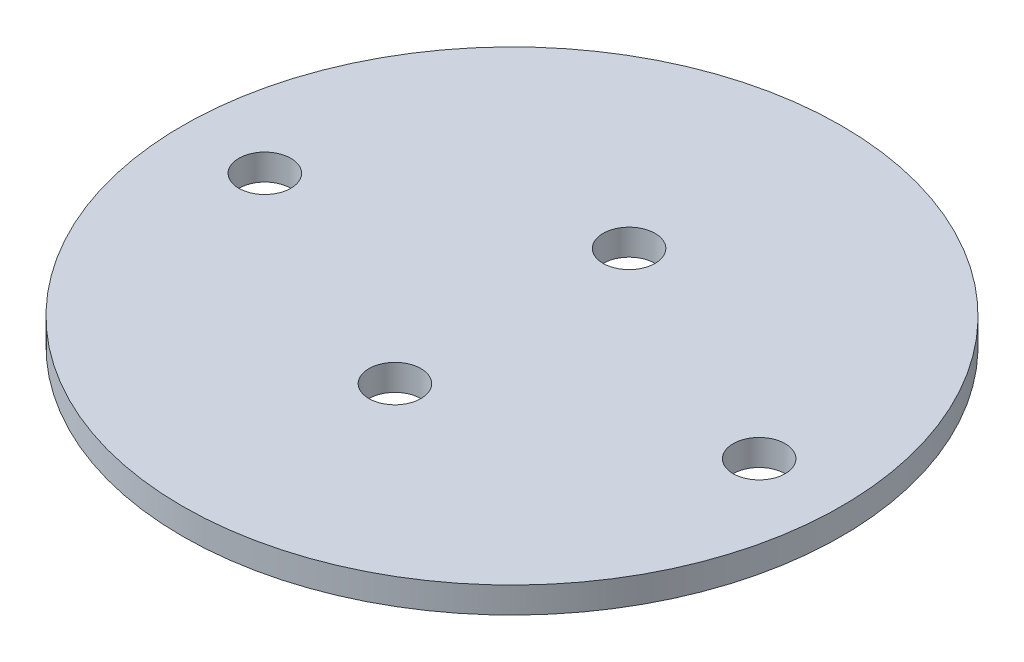
ISO-10303-21;
HEADER;
FILE_DESCRIPTION(('STEP AP214'),'2;1');
FILE_NAME('part.step','',(''),(''),'','','');
FILE_SCHEMA(('AUTOMOTIVE_DESIGN { 1 0 10303 214 1 1 1 1 }'));
ENDSEC;
DATA;
#1=APPLICATION_CONTEXT('core data for automotive mechanical design processes');
#2=APPLICATION_PROTOCOL_DEFINITION('international standard','automotive_design',2000,#1);
#3=PRODUCT_CONTEXT('',#1,'mechanical');
#4=PRODUCT('Part','Part','',(#3));
#5=PRODUCT_RELATED_PRODUCT_CATEGORY('part','',(#4));
#6=PRODUCT_DEFINITION_FORMATION('','',#4);
#7=PRODUCT_DEFINITION_CONTEXT('part definition',#1,'design');
#8=PRODUCT_DEFINITION('design','',#6,#7);
#9=PRODUCT_DEFINITION_SHAPE('','',#8);
#10=(LENGTH_UNIT() NAMED_UNIT(*) SI_UNIT(.MILLI.,.METRE.));
#11=(NAMED_UNIT(*) PLANE_ANGLE_UNIT() SI_UNIT($,.RADIAN.));
#12=(NAMED_UNIT(*) SI_UNIT($,.STERADIAN.) SOLID_ANGLE_UNIT());
#13=UNCERTAINTY_MEASURE_WITH_UNIT(LENGTH_MEASURE(1.E-05),#10,'distance_accuracy_value','');
#14=(GEOMETRIC_REPRESENTATION_CONTEXT(3) GLOBAL_UNCERTAINTY_ASSIGNED_CONTEXT((#13)) GLOBAL_UNIT_ASSIGNED_CONTEXT((#10,
#11,#12)) REPRESENTATION_CONTEXT('',''));
#15=CARTESIAN_POINT('',(0.,0.,0.));
#16=DIRECTION('',(0.,0.,1.));
#17=DIRECTION('',(1.,0.,0.));
#18=AXIS2_PLACEMENT_3D('',#15,#16,#17);
#19=CARTESIAN_POINT('',(28.5,-3.,0.));
#20=DIRECTION('',(0.,1.,0.));
#21=DIRECTION('',(0.,0.,1.));
#22=AXIS2_PLACEMENT_3D('',#19,#20,#21);
#23=CYLINDRICAL_SURFACE('',#22,3.);
#24=CARTESIAN_POINT('',(28.5,-3.,0.));
#25=DIRECTION('',(0.,1.,0.));
#26=DIRECTION('',(0.,0.,1.));
#27=AXIS2_PLACEMENT_3D('',#24,#25,#26);
#28=CIRCLE('',#27,3.);
#29=CARTESIAN_POINT('',(28.5,-3.,2.99999999999999));
#30=VERTEX_POINT('',#29);
#31=EDGE_CURVE('E45',#30,#30,#28,.T.);
#32=ORIENTED_EDGE('',*,*,#31,.F.);
#33=EDGE_LOOP('',(#32));
#34=FACE_BOUND('',#33,.T.);
#35=CARTESIAN_POINT('',(28.5,0.,0.));
#36=DIRECTION('',(0.,1.,0.));
#37=DIRECTION('',(0.,0.,1.));
#38=AXIS2_PLACEMENT_3D('',#35,#36,#37);
#39=CIRCLE('',#38,3.);
#40=CARTESIAN_POINT('',(28.5,0.,2.99999999999999));
#41=VERTEX_POINT('',#40);
#42=EDGE_CURVE('E62',#41,#41,#39,.T.);
#43=ORIENTED_EDGE('',*,*,#42,.T.);
#44=EDGE_LOOP('',(#43));
#45=FACE_BOUND('',#44,.T.);
#46=ADVANCED_FACE('F37',(#34,#45),#23,.F.);
#47=CARTESIAN_POINT('',(-28.5,-3.,0.));
#48=DIRECTION('',(0.,1.,0.));
#49=DIRECTION('',(0.,0.,1.));
#50=AXIS2_PLACEMENT_3D('',#47,#48,#49);
#51=CYLINDRICAL_SURFACE('',#50,3.);
#52=CARTESIAN_POINT('',(-28.5,-3.,0.));
#53=DIRECTION('',(0.,1.,0.));
#54=DIRECTION('',(0.,0.,1.));
#55=AXIS2_PLACEMENT_3D('',#52,#53,#54);
#56=CIRCLE('',#55,3.);
#57=CARTESIAN_POINT('',(-28.5,-3.,3.));
#58=VERTEX_POINT('',#57);
#59=EDGE_CURVE('E50',#58,#58,#56,.T.);
#60=ORIENTED_EDGE('',*,*,#59,.F.);
#61=EDGE_LOOP('',(#60));
#62=FACE_BOUND('',#61,.T.);
#63=CARTESIAN_POINT('',(-28.5,0.,0.));
#64=DIRECTION('',(0.,1.,0.));
#65=DIRECTION('',(0.,0.,1.));
#66=AXIS2_PLACEMENT_3D('',#63,#64,#65);
#67=CIRCLE('',#66,3.);
#68=CARTESIAN_POINT('',(-28.5,0.,3.));
#69=VERTEX_POINT('',#68);
#70=EDGE_CURVE('E60',#69,#69,#67,.T.);
#71=ORIENTED_EDGE('',*,*,#70,.T.);
#72=EDGE_LOOP('',(#71));
#73=FACE_BOUND('',#72,.T.);
#74=ADVANCED_FACE('F83',(#62,#73),#51,.F.);
#75=CARTESIAN_POINT('',(0.,-3.,-13.5));
#76=DIRECTION('',(0.,1.,0.));
#77=DIRECTION('',(0.,0.,1.));
#78=AXIS2_PLACEMENT_3D('',#75,#76,#77);
#79=CYLINDRICAL_SURFACE('',#78,3.);
#80=CARTESIAN_POINT('',(0.,-3.,-13.5));
#81=DIRECTION('',(0.,1.,0.));
#82=DIRECTION('',(0.,0.,1.));
#83=AXIS2_PLACEMENT_3D('',#80,#81,#82);
#84=CIRCLE('',#83,3.);
#85=CARTESIAN_POINT('',(0.,-3.,-10.5));
#86=VERTEX_POINT('',#85);
#87=EDGE_CURVE('E71',#86,#86,#84,.T.);
#88=ORIENTED_EDGE('',*,*,#87,.F.);
#89=EDGE_LOOP('',(#88));
#90=FACE_BOUND('',#89,.T.);
#91=CARTESIAN_POINT('',(0.,0.,-13.5));
#92=DIRECTION('',(0.,1.,0.));
#93=DIRECTION('',(0.,0.,1.));
#94=AXIS2_PLACEMENT_3D('',#91,#92,#93);
#95=CIRCLE('',#94,3.);
#96=CARTESIAN_POINT('',(0.,0.,-10.5));
#97=VERTEX_POINT('',#96);
#98=EDGE_CURVE('E57',#97,#97,#95,.T.);
#99=ORIENTED_EDGE('',*,*,#98,.T.);
#100=EDGE_LOOP('',(#99));
#101=FACE_BOUND('',#100,.T.);
#102=ADVANCED_FACE('F86',(#90,#101),#79,.F.);
#103=CARTESIAN_POINT('',(0.,-3.,13.5));
#104=DIRECTION('',(0.,1.,0.));
#105=DIRECTION('',(0.,0.,1.));
#106=AXIS2_PLACEMENT_3D('',#103,#104,#105);
#107=CYLINDRICAL_SURFACE('',#106,3.);
#108=CARTESIAN_POINT('',(0.,-3.,13.5));
#109=DIRECTION('',(0.,1.,0.));
#110=DIRECTION('',(0.,0.,1.));
#111=AXIS2_PLACEMENT_3D('',#108,#109,#110);
#112=CIRCLE('',#111,3.);
#113=CARTESIAN_POINT('',(0.,-3.,16.5));
#114=VERTEX_POINT('',#113);
#115=EDGE_CURVE('E67',#114,#114,#112,.T.);
#116=ORIENTED_EDGE('',*,*,#115,.F.);
#117=EDGE_LOOP('',(#116));
#118=FACE_BOUND('',#117,.T.);
#119=CARTESIAN_POINT('',(0.,0.,13.5));
#120=DIRECTION('',(0.,1.,0.));
#121=DIRECTION('',(0.,0.,1.));
#122=AXIS2_PLACEMENT_3D('',#119,#120,#121);
#123=CIRCLE('',#122,3.);
#124=CARTESIAN_POINT('',(0.,0.,16.5));
#125=VERTEX_POINT('',#124);
#126=EDGE_CURVE('E54',#125,#125,#123,.T.);
#127=ORIENTED_EDGE('',*,*,#126,.T.);
#128=EDGE_LOOP('',(#127));
#129=FACE_BOUND('',#128,.T.);
#130=ADVANCED_FACE('F39',(#118,#129),#107,.F.);
#131=CARTESIAN_POINT('',(0.,-3.,0.));
#132=DIRECTION('',(0.,1.,0.));
#133=DIRECTION('',(0.,0.,1.));
#134=AXIS2_PLACEMENT_3D('',#131,#132,#133);
#135=CYLINDRICAL_SURFACE('',#134,38.);
#136=CARTESIAN_POINT('',(0.,-3.,0.));
#137=DIRECTION('',(0.,1.,0.));
#138=DIRECTION('',(0.,0.,1.));
#139=AXIS2_PLACEMENT_3D('',#136,#137,#138);
#140=CIRCLE('',#139,38.);
#141=CARTESIAN_POINT('',(0.,-3.,38.));
#142=VERTEX_POINT('',#141);
#143=EDGE_CURVE('E10',#142,#142,#140,.T.);
#144=ORIENTED_EDGE('',*,*,#143,.T.);
#145=EDGE_LOOP('',(#144));
#146=FACE_BOUND('',#145,.T.);
#147=CARTESIAN_POINT('',(0.,0.,0.));
#148=DIRECTION('',(0.,1.,0.));
#149=DIRECTION('',(0.,0.,1.));
#150=AXIS2_PLACEMENT_3D('',#147,#148,#149);
#151=CIRCLE('',#150,38.);
#152=CARTESIAN_POINT('',(0.,0.,38.));
#153=VERTEX_POINT('',#152);
#154=EDGE_CURVE('E41',#153,#153,#151,.T.);
#155=ORIENTED_EDGE('',*,*,#154,.F.);
#156=EDGE_LOOP('',(#155));
#157=FACE_BOUND('',#156,.T.);
#158=ADVANCED_FACE('F98',(#146,#157),#135,.T.);
#159=CARTESIAN_POINT('',(0.,-3.,0.));
#160=DIRECTION('',(0.,1.,0.));
#161=DIRECTION('',(0.,0.,1.));
#162=AXIS2_PLACEMENT_3D('',#159,#160,#161);
#163=PLANE('',#162);
#164=ORIENTED_EDGE('',*,*,#115,.T.);
#165=EDGE_LOOP('',(#164));
#166=FACE_BOUND('',#165,.T.);
#167=ORIENTED_EDGE('',*,*,#87,.T.);
#168=EDGE_LOOP('',(#167));
#169=FACE_BOUND('',#168,.T.);
#170=ORIENTED_EDGE('',*,*,#59,.T.);
#171=EDGE_LOOP('',(#170));
#172=FACE_BOUND('',#171,.T.);
#173=ORIENTED_EDGE('',*,*,#31,.T.);
#174=EDGE_LOOP('',(#173));
#175=FACE_BOUND('',#174,.T.);
#176=ORIENTED_EDGE('',*,*,#143,.F.);
#177=EDGE_LOOP('',(#176));
#178=FACE_BOUND('',#177,.T.);
#179=ADVANCED_FACE('F80',(#166,#169,#172,#175,#178),#163,.F.);
#180=CARTESIAN_POINT('',(0.,0.,0.));
#181=DIRECTION('',(0.,1.,0.));
#182=DIRECTION('',(0.,0.,1.));
#183=AXIS2_PLACEMENT_3D('',#180,#181,#182);
#184=PLANE('',#183);
#185=ORIENTED_EDGE('',*,*,#126,.F.);
#186=EDGE_LOOP('',(#185));
#187=FACE_BOUND('',#186,.T.);
#188=ORIENTED_EDGE('',*,*,#98,.F.);
#189=EDGE_LOOP('',(#188));
#190=FACE_BOUND('',#189,.T.);
#191=ORIENTED_EDGE('',*,*,#70,.F.);
#192=EDGE_LOOP('',(#191));
#193=FACE_BOUND('',#192,.T.);
#194=ORIENTED_EDGE('',*,*,#42,.F.);
#195=EDGE_LOOP('',(#194));
#196=FACE_BOUND('',#195,.T.);
#197=ORIENTED_EDGE('',*,*,#154,.T.);
#198=EDGE_LOOP('',(#197));
#199=FACE_BOUND('',#198,.T.);
#200=ADVANCED_FACE('F90',(#187,#190,#193,#196,#199),#184,.T.);
#201=CLOSED_SHELL('',(#46,#74,#102,#130,#158,#179,#200));
#202=MANIFOLD_SOLID_BREP('B2',#201);
#203=ADVANCED_BREP_SHAPE_REPRESENTATION('',(#18,#202),#14);
#204=SHAPE_DEFINITION_REPRESENTATION(#9,#203);
ENDSEC;
END-ISO-10303-21;
